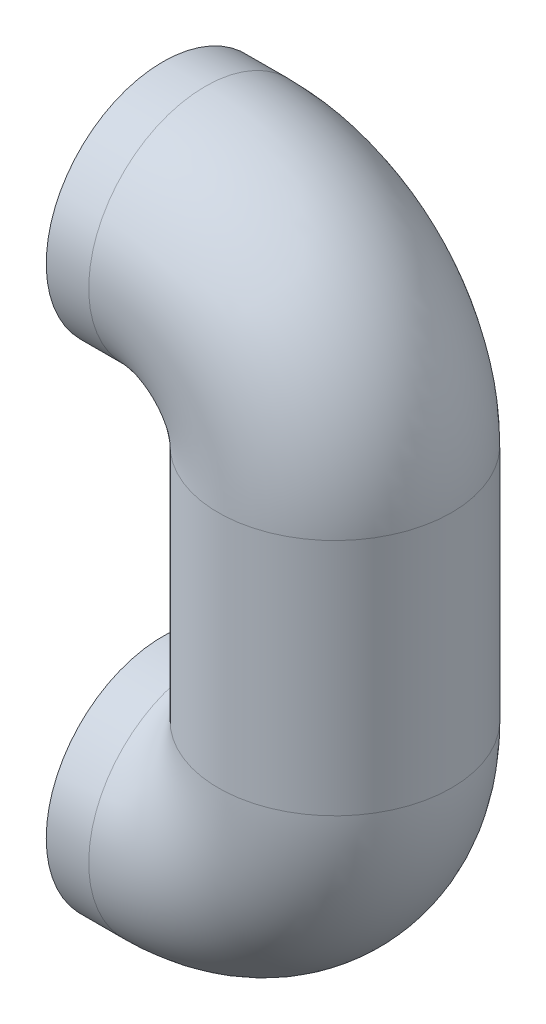
ISO-10303-21;
HEADER;
FILE_DESCRIPTION(('STEP AP214'),'2;1');
FILE_NAME('part.step','',(''),(''),'','','');
FILE_SCHEMA(('AUTOMOTIVE_DESIGN { 1 0 10303 214 1 1 1 1 }'));
ENDSEC;
DATA;
#1=APPLICATION_CONTEXT('core data for automotive mechanical design processes');
#2=APPLICATION_PROTOCOL_DEFINITION('international standard','automotive_design',2000,#1);
#3=PRODUCT_CONTEXT('',#1,'mechanical');
#4=PRODUCT('Part','Part','',(#3));
#5=PRODUCT_RELATED_PRODUCT_CATEGORY('part','',(#4));
#6=PRODUCT_DEFINITION_FORMATION('','',#4);
#7=PRODUCT_DEFINITION_CONTEXT('part definition',#1,'design');
#8=PRODUCT_DEFINITION('design','',#6,#7);
#9=PRODUCT_DEFINITION_SHAPE('','',#8);
#10=(LENGTH_UNIT() NAMED_UNIT(*) SI_UNIT(.MILLI.,.METRE.));
#11=(NAMED_UNIT(*) PLANE_ANGLE_UNIT() SI_UNIT($,.RADIAN.));
#12=(NAMED_UNIT(*) SI_UNIT($,.STERADIAN.) SOLID_ANGLE_UNIT());
#13=UNCERTAINTY_MEASURE_WITH_UNIT(LENGTH_MEASURE(1.E-05),#10,'distance_accuracy_value','');
#14=(GEOMETRIC_REPRESENTATION_CONTEXT(3) GLOBAL_UNCERTAINTY_ASSIGNED_CONTEXT((#13)) GLOBAL_UNIT_ASSIGNED_CONTEXT((#10,
#11,#12)) REPRESENTATION_CONTEXT('',''));
#15=CARTESIAN_POINT('',(0.,0.,0.));
#16=DIRECTION('',(0.,0.,1.));
#17=DIRECTION('',(1.,0.,0.));
#18=AXIS2_PLACEMENT_3D('',#15,#16,#17);
#19=CARTESIAN_POINT('',(0.,0.,0.));
#20=DIRECTION('',(1.,0.,0.));
#21=DIRECTION('',(0.,0.,-1.));
#22=AXIS2_PLACEMENT_3D('',#19,#20,#21);
#23=PLANE('',#22);
#24=CARTESIAN_POINT('',(0.,0.,0.));
#25=DIRECTION('',(1.,0.,0.));
#26=DIRECTION('',(0.,0.,-1.));
#27=AXIS2_PLACEMENT_3D('',#24,#25,#26);
#28=CIRCLE('',#27,22.5);
#29=CARTESIAN_POINT('',(0.,0.,-22.5));
#30=VERTEX_POINT('',#29);
#31=EDGE_CURVE('E55',#30,#30,#28,.T.);
#32=ORIENTED_EDGE('',*,*,#31,.F.);
#33=EDGE_LOOP('',(#32));
#34=FACE_BOUND('',#33,.T.);
#35=ADVANCED_FACE('F33',(#34),#23,.F.);
#36=CARTESIAN_POINT('',(0.,96.,0.));
#37=DIRECTION('',(-1.,0.,0.));
#38=DIRECTION('',(0.,0.,-1.));
#39=AXIS2_PLACEMENT_3D('',#36,#37,#38);
#40=PLANE('',#39);
#41=CARTESIAN_POINT('',(0.,96.,0.));
#42=DIRECTION('',(-1.,0.,0.));
#43=DIRECTION('',(0.,0.,-1.));
#44=AXIS2_PLACEMENT_3D('',#41,#42,#43);
#45=CIRCLE('',#44,22.5);
#46=CARTESIAN_POINT('',(0.,96.,-22.5));
#47=VERTEX_POINT('',#46);
#48=EDGE_CURVE('E10',#47,#47,#45,.T.);
#49=ORIENTED_EDGE('',*,*,#48,.T.);
#50=EDGE_LOOP('',(#49));
#51=FACE_BOUND('',#50,.T.);
#52=ADVANCED_FACE('F62',(#51),#40,.T.);
#53=CARTESIAN_POINT('',(0.,0.,0.));
#54=DIRECTION('',(1.,0.,0.));
#55=DIRECTION('',(0.,0.,-1.));
#56=AXIS2_PLACEMENT_3D('',#53,#54,#55);
#57=CYLINDRICAL_SURFACE('',#56,22.5);
#58=CARTESIAN_POINT('',(8.19999999999983,0.,0.));
#59=DIRECTION('',(1.,0.,0.));
#60=DIRECTION('',(0.,0.,-1.));
#61=AXIS2_PLACEMENT_3D('',#58,#59,#60);
#62=CIRCLE('',#61,22.5);
#63=CARTESIAN_POINT('',(8.19999999999967,-22.5,0.));
#64=VERTEX_POINT('',#63);
#65=EDGE_CURVE('E52',#64,#64,#62,.T.);
#66=ORIENTED_EDGE('',*,*,#65,.F.);
#67=EDGE_LOOP('',(#66));
#68=FACE_BOUND('',#67,.T.);
#69=ORIENTED_EDGE('',*,*,#31,.T.);
#70=EDGE_LOOP('',(#69));
#71=FACE_BOUND('',#70,.T.);
#72=ADVANCED_FACE('F59',(#68,#71),#57,.T.);
#73=CARTESIAN_POINT('',(8.2,25.,0.));
#74=DIRECTION('',(0.,0.,1.));
#75=DIRECTION('',(1.,0.,0.));
#76=AXIS2_PLACEMENT_3D('',#73,#74,#75);
#77=TOROIDAL_SURFACE('',#76,25.,22.5);
#78=CARTESIAN_POINT('',(33.2,25.,0.));
#79=DIRECTION('',(0.,1.,0.));
#80=DIRECTION('',(0.,0.,-1.));
#81=AXIS2_PLACEMENT_3D('',#78,#79,#80);
#82=CIRCLE('',#81,22.5);
#83=CARTESIAN_POINT('',(55.7,25.,0.));
#84=VERTEX_POINT('',#83);
#85=EDGE_CURVE('E47',#84,#84,#82,.T.);
#86=CARTESIAN_POINT('',(8.2,25.,0.));
#87=DIRECTION('',(0.,0.,1.));
#88=DIRECTION('',(1.,0.,0.));
#89=AXIS2_PLACEMENT_3D('',#86,#87,#88);
#90=CIRCLE('',#89,47.5);
#91=EDGE_CURVE('',#64,#84,#90,.T.);
#92=ORIENTED_EDGE('',*,*,#65,.T.);
#93=ORIENTED_EDGE('',*,*,#85,.F.);
#94=ORIENTED_EDGE('',*,*,#91,.T.);
#95=ORIENTED_EDGE('',*,*,#91,.F.);
#96=EDGE_LOOP('',(#92,#94,#93,#95));
#97=FACE_BOUND('',#96,.T.);
#98=ADVANCED_FACE('F80',(#97),#77,.T.);
#99=CARTESIAN_POINT('',(33.2,25.,0.));
#100=DIRECTION('',(0.,1.,0.));
#101=DIRECTION('',(0.,0.,1.));
#102=AXIS2_PLACEMENT_3D('',#99,#100,#101);
#103=CYLINDRICAL_SURFACE('',#102,22.5);
#104=CARTESIAN_POINT('',(33.2,70.9999999999998,0.));
#105=DIRECTION('',(0.,1.,0.));
#106=DIRECTION('',(0.,0.,-1.));
#107=AXIS2_PLACEMENT_3D('',#104,#105,#106);
#108=CIRCLE('',#107,22.5);
#109=CARTESIAN_POINT('',(55.7,70.9999999999997,0.));
#110=VERTEX_POINT('',#109);
#111=EDGE_CURVE('E43',#110,#110,#108,.T.);
#112=ORIENTED_EDGE('',*,*,#111,.F.);
#113=EDGE_LOOP('',(#112));
#114=FACE_BOUND('',#113,.T.);
#115=ORIENTED_EDGE('',*,*,#85,.T.);
#116=EDGE_LOOP('',(#115));
#117=FACE_BOUND('',#116,.T.);
#118=ADVANCED_FACE('F74',(#114,#117),#103,.T.);
#119=CARTESIAN_POINT('',(8.20000000000001,71.,0.));
#120=DIRECTION('',(0.,0.,1.));
#121=DIRECTION('',(1.,0.,0.));
#122=AXIS2_PLACEMENT_3D('',#119,#120,#121);
#123=TOROIDAL_SURFACE('',#122,25.,22.5);
#124=CARTESIAN_POINT('',(8.19999999999983,96.,0.));
#125=DIRECTION('',(-1.,0.,0.));
#126=DIRECTION('',(0.,0.,-1.));
#127=AXIS2_PLACEMENT_3D('',#124,#125,#126);
#128=CIRCLE('',#127,22.5);
#129=CARTESIAN_POINT('',(8.19999999999967,118.5,0.));
#130=VERTEX_POINT('',#129);
#131=EDGE_CURVE('E39',#130,#130,#128,.T.);
#132=CARTESIAN_POINT('',(8.20000000000001,71.,0.));
#133=DIRECTION('',(0.,0.,1.));
#134=DIRECTION('',(1.,0.,0.));
#135=AXIS2_PLACEMENT_3D('',#132,#133,#134);
#136=CIRCLE('',#135,47.5);
#137=EDGE_CURVE('',#110,#130,#136,.T.);
#138=ORIENTED_EDGE('',*,*,#111,.T.);
#139=ORIENTED_EDGE('',*,*,#131,.F.);
#140=ORIENTED_EDGE('',*,*,#137,.T.);
#141=ORIENTED_EDGE('',*,*,#137,.F.);
#142=EDGE_LOOP('',(#138,#140,#139,#141));
#143=FACE_BOUND('',#142,.T.);
#144=ADVANCED_FACE('F68',(#143),#123,.T.);
#145=CARTESIAN_POINT('',(8.19999999999983,96.,0.));
#146=DIRECTION('',(-1.,0.,0.));
#147=DIRECTION('',(0.,0.,1.));
#148=AXIS2_PLACEMENT_3D('',#145,#146,#147);
#149=CYLINDRICAL_SURFACE('',#148,22.5);
#150=ORIENTED_EDGE('',*,*,#48,.F.);
#151=EDGE_LOOP('',(#150));
#152=FACE_BOUND('',#151,.T.);
#153=ORIENTED_EDGE('',*,*,#131,.T.);
#154=EDGE_LOOP('',(#153));
#155=FACE_BOUND('',#154,.T.);
#156=ADVANCED_FACE('F66',(#152,#155),#149,.T.);
#157=CLOSED_SHELL('',(#35,#52,#72,#98,#118,#144,#156));
#158=MANIFOLD_SOLID_BREP('B2',#157);
#159=ADVANCED_BREP_SHAPE_REPRESENTATION('',(#18,#158),#14);
#160=SHAPE_DEFINITION_REPRESENTATION(#9,#159);
ENDSEC;
END-ISO-10303-21;
